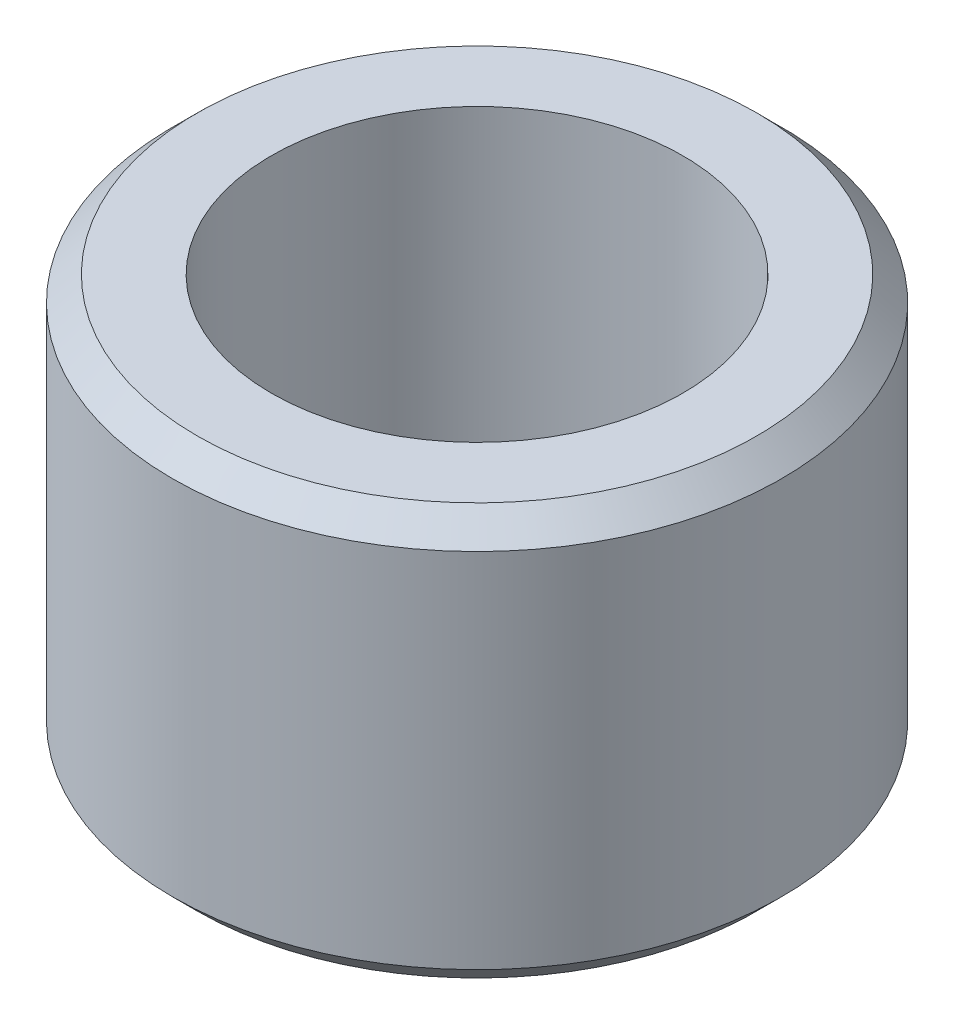
ISO-10303-21;
HEADER;
FILE_DESCRIPTION(('STEP AP214'),'2;1');
FILE_NAME('part.step','',(''),(''),'','','');
FILE_SCHEMA(('AUTOMOTIVE_DESIGN { 1 0 10303 214 1 1 1 1 }'));
ENDSEC;
DATA;
#1=APPLICATION_CONTEXT('core data for automotive mechanical design processes');
#2=APPLICATION_PROTOCOL_DEFINITION('international standard','automotive_design',2000,#1);
#3=PRODUCT_CONTEXT('',#1,'mechanical');
#4=PRODUCT('Part','Part','',(#3));
#5=PRODUCT_RELATED_PRODUCT_CATEGORY('part','',(#4));
#6=PRODUCT_DEFINITION_FORMATION('','',#4);
#7=PRODUCT_DEFINITION_CONTEXT('part definition',#1,'design');
#8=PRODUCT_DEFINITION('design','',#6,#7);
#9=PRODUCT_DEFINITION_SHAPE('','',#8);
#10=(LENGTH_UNIT() NAMED_UNIT(*) SI_UNIT(.MILLI.,.METRE.));
#11=(NAMED_UNIT(*) PLANE_ANGLE_UNIT() SI_UNIT($,.RADIAN.));
#12=(NAMED_UNIT(*) SI_UNIT($,.STERADIAN.) SOLID_ANGLE_UNIT());
#13=UNCERTAINTY_MEASURE_WITH_UNIT(LENGTH_MEASURE(1.E-05),#10,'distance_accuracy_value','');
#14=(GEOMETRIC_REPRESENTATION_CONTEXT(3) GLOBAL_UNCERTAINTY_ASSIGNED_CONTEXT((#13)) GLOBAL_UNIT_ASSIGNED_CONTEXT((#10,
#11,#12)) REPRESENTATION_CONTEXT('',''));
#15=CARTESIAN_POINT('',(0.,0.,0.));
#16=DIRECTION('',(0.,0.,1.));
#17=DIRECTION('',(1.,0.,0.));
#18=AXIS2_PLACEMENT_3D('',#15,#16,#17);
#19=CARTESIAN_POINT('',(0.,5.,0.));
#20=DIRECTION('',(0.,1.,0.));
#21=DIRECTION('',(0.,0.,1.));
#22=AXIS2_PLACEMENT_3D('',#19,#20,#21);
#23=PLANE('',#22);
#24=CARTESIAN_POINT('',(0.,5.,0.));
#25=DIRECTION('',(0.,1.,0.));
#26=DIRECTION('',(0.,0.,1.));
#27=AXIS2_PLACEMENT_3D('',#24,#25,#26);
#28=CIRCLE('',#27,3.4);
#29=CARTESIAN_POINT('',(0.,5.,3.4));
#30=VERTEX_POINT('',#29);
#31=EDGE_CURVE('E10',#30,#30,#28,.T.);
#32=ORIENTED_EDGE('',*,*,#31,.T.);
#33=EDGE_LOOP('',(#32));
#34=FACE_BOUND('',#33,.T.);
#35=CARTESIAN_POINT('',(0.,5.,0.));
#36=DIRECTION('',(0.,1.,0.));
#37=DIRECTION('',(0.,0.,1.));
#38=AXIS2_PLACEMENT_3D('',#35,#36,#37);
#39=CIRCLE('',#38,2.5);
#40=CARTESIAN_POINT('',(0.,5.,2.5));
#41=VERTEX_POINT('',#40);
#42=EDGE_CURVE('E51',#41,#41,#39,.T.);
#43=ORIENTED_EDGE('',*,*,#42,.F.);
#44=EDGE_LOOP('',(#43));
#45=FACE_BOUND('',#44,.T.);
#46=ADVANCED_FACE('F31',(#34,#45),#23,.T.);
#47=CARTESIAN_POINT('',(0.,0.,0.));
#48=DIRECTION('',(0.,1.,0.));
#49=DIRECTION('',(0.,0.,1.));
#50=AXIS2_PLACEMENT_3D('',#47,#48,#49);
#51=PLANE('',#50);
#52=CARTESIAN_POINT('',(0.,0.,0.));
#53=DIRECTION('',(0.,1.,0.));
#54=DIRECTION('',(0.,0.,1.));
#55=AXIS2_PLACEMENT_3D('',#52,#53,#54);
#56=CIRCLE('',#55,3.4);
#57=CARTESIAN_POINT('',(0.,0.,3.4));
#58=VERTEX_POINT('',#57);
#59=EDGE_CURVE('E38',#58,#58,#56,.F.);
#60=ORIENTED_EDGE('',*,*,#59,.T.);
#61=EDGE_LOOP('',(#60));
#62=FACE_BOUND('',#61,.T.);
#63=CARTESIAN_POINT('',(0.,0.,0.));
#64=DIRECTION('',(0.,1.,0.));
#65=DIRECTION('',(0.,0.,1.));
#66=AXIS2_PLACEMENT_3D('',#63,#64,#65);
#67=CIRCLE('',#66,2.5);
#68=CARTESIAN_POINT('',(0.,0.,2.5));
#69=VERTEX_POINT('',#68);
#70=EDGE_CURVE('E52',#69,#69,#67,.T.);
#71=ORIENTED_EDGE('',*,*,#70,.T.);
#72=EDGE_LOOP('',(#71));
#73=FACE_BOUND('',#72,.T.);
#74=ADVANCED_FACE('F62',(#62,#73),#51,.F.);
#75=CARTESIAN_POINT('',(0.,5.,0.));
#76=DIRECTION('',(0.,-1.,0.));
#77=DIRECTION('',(0.,0.,-1.));
#78=AXIS2_PLACEMENT_3D('',#75,#76,#77);
#79=CYLINDRICAL_SURFACE('',#78,3.7);
#80=CARTESIAN_POINT('',(0.,0.300000000000003,0.));
#81=DIRECTION('',(0.,1.,0.));
#82=DIRECTION('',(0.,0.,1.));
#83=AXIS2_PLACEMENT_3D('',#80,#81,#82);
#84=CIRCLE('',#83,3.7);
#85=CARTESIAN_POINT('',(0.,0.300000000000003,3.7));
#86=VERTEX_POINT('',#85);
#87=EDGE_CURVE('E42',#86,#86,#84,.T.);
#88=ORIENTED_EDGE('',*,*,#87,.T.);
#89=EDGE_LOOP('',(#88));
#90=FACE_BOUND('',#89,.T.);
#91=CARTESIAN_POINT('',(0.,4.7,0.));
#92=DIRECTION('',(0.,1.,0.));
#93=DIRECTION('',(0.,0.,1.));
#94=AXIS2_PLACEMENT_3D('',#91,#92,#93);
#95=CIRCLE('',#94,3.7);
#96=CARTESIAN_POINT('',(0.,4.7,3.7));
#97=VERTEX_POINT('',#96);
#98=EDGE_CURVE('E46',#97,#97,#95,.F.);
#99=ORIENTED_EDGE('',*,*,#98,.T.);
#100=EDGE_LOOP('',(#99));
#101=FACE_BOUND('',#100,.T.);
#102=ADVANCED_FACE('F67',(#90,#101),#79,.T.);
#103=CARTESIAN_POINT('',(0.,5.,0.));
#104=DIRECTION('',(0.,-1.,0.));
#105=DIRECTION('',(0.,0.,-1.));
#106=AXIS2_PLACEMENT_3D('',#103,#104,#105);
#107=CYLINDRICAL_SURFACE('',#106,2.5);
#108=ORIENTED_EDGE('',*,*,#42,.T.);
#109=EDGE_LOOP('',(#108));
#110=FACE_BOUND('',#109,.T.);
#111=ORIENTED_EDGE('',*,*,#70,.F.);
#112=EDGE_LOOP('',(#111));
#113=FACE_BOUND('',#112,.T.);
#114=ADVANCED_FACE('F58',(#110,#113),#107,.F.);
#115=CARTESIAN_POINT('',(0.,0.300000000000003,0.));
#116=DIRECTION('',(0.,1.,0.));
#117=DIRECTION('',(0.,0.,1.));
#118=AXIS2_PLACEMENT_3D('',#115,#116,#117);
#119=CONICAL_SURFACE('',#118,3.7,0.785398163397451);
#120=ORIENTED_EDGE('',*,*,#59,.F.);
#121=EDGE_LOOP('',(#120));
#122=FACE_BOUND('',#121,.T.);
#123=ORIENTED_EDGE('',*,*,#87,.F.);
#124=EDGE_LOOP('',(#123));
#125=FACE_BOUND('',#124,.T.);
#126=ADVANCED_FACE('F73',(#122,#125),#119,.T.);
#127=CARTESIAN_POINT('',(0.,5.,0.));
#128=DIRECTION('',(0.,-1.,0.));
#129=DIRECTION('',(0.,0.,-1.));
#130=AXIS2_PLACEMENT_3D('',#127,#128,#129);
#131=CONICAL_SURFACE('',#130,3.4,0.785398163397448);
#132=ORIENTED_EDGE('',*,*,#98,.F.);
#133=EDGE_LOOP('',(#132));
#134=FACE_BOUND('',#133,.T.);
#135=ORIENTED_EDGE('',*,*,#31,.F.);
#136=EDGE_LOOP('',(#135));
#137=FACE_BOUND('',#136,.T.);
#138=ADVANCED_FACE('F33',(#134,#137),#131,.T.);
#139=CLOSED_SHELL('',(#46,#74,#102,#114,#126,#138));
#140=MANIFOLD_SOLID_BREP('B2',#139);
#141=ADVANCED_BREP_SHAPE_REPRESENTATION('',(#18,#140),#14);
#142=SHAPE_DEFINITION_REPRESENTATION(#9,#141);
ENDSEC;
END-ISO-10303-21;
